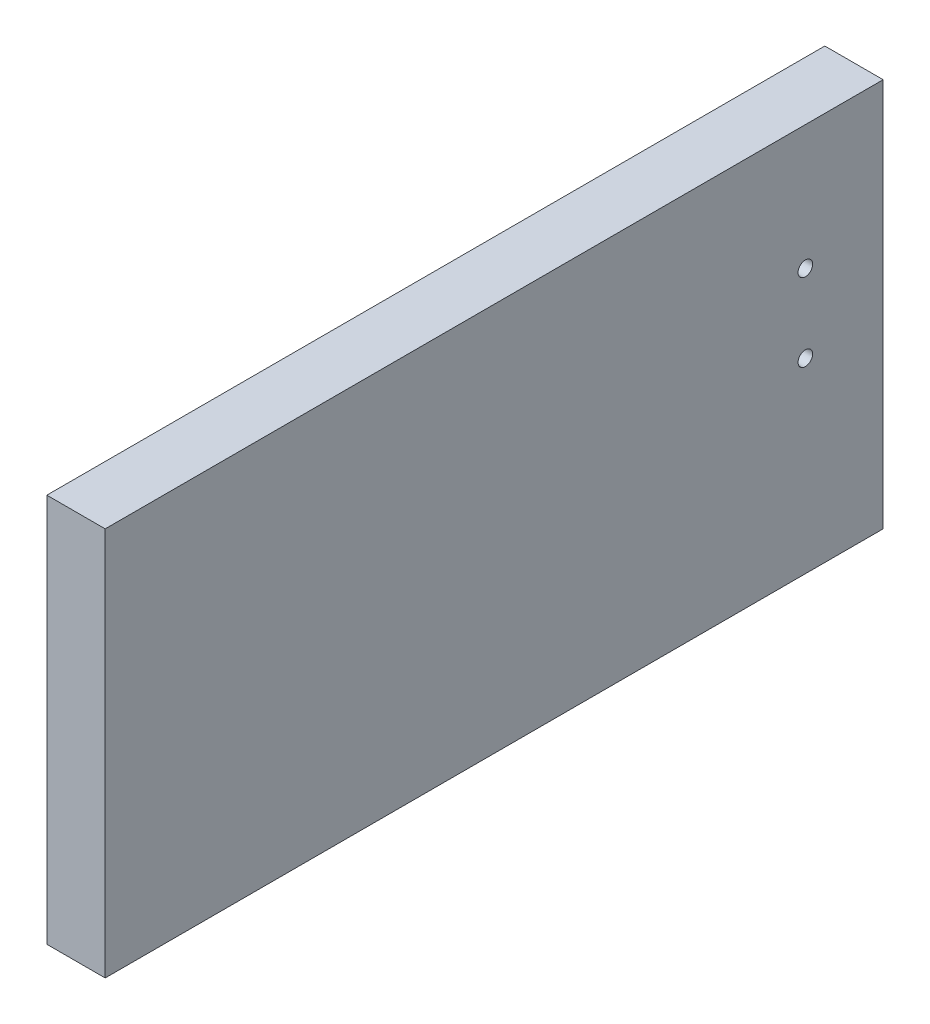
ISO-10303-21;
HEADER;
FILE_DESCRIPTION(('STEP AP214'),'2;1');
FILE_NAME('part.step','',(''),(''),'','','');
FILE_SCHEMA(('AUTOMOTIVE_DESIGN { 1 0 10303 214 1 1 1 1 }'));
ENDSEC;
DATA;
#1=APPLICATION_CONTEXT('core data for automotive mechanical design processes');
#2=APPLICATION_PROTOCOL_DEFINITION('international standard','automotive_design',2000,#1);
#3=PRODUCT_CONTEXT('',#1,'mechanical');
#4=PRODUCT('Part','Part','',(#3));
#5=PRODUCT_RELATED_PRODUCT_CATEGORY('part','',(#4));
#6=PRODUCT_DEFINITION_FORMATION('','',#4);
#7=PRODUCT_DEFINITION_CONTEXT('part definition',#1,'design');
#8=PRODUCT_DEFINITION('design','',#6,#7);
#9=PRODUCT_DEFINITION_SHAPE('','',#8);
#10=(LENGTH_UNIT() NAMED_UNIT(*) SI_UNIT(.MILLI.,.METRE.));
#11=(NAMED_UNIT(*) PLANE_ANGLE_UNIT() SI_UNIT($,.RADIAN.));
#12=(NAMED_UNIT(*) SI_UNIT($,.STERADIAN.) SOLID_ANGLE_UNIT());
#13=UNCERTAINTY_MEASURE_WITH_UNIT(LENGTH_MEASURE(1.E-05),#10,'distance_accuracy_value','');
#14=(GEOMETRIC_REPRESENTATION_CONTEXT(3) GLOBAL_UNCERTAINTY_ASSIGNED_CONTEXT((#13)) GLOBAL_UNIT_ASSIGNED_CONTEXT((#10,
#11,#12)) REPRESENTATION_CONTEXT('',''));
#15=CARTESIAN_POINT('',(0.,0.,0.));
#16=DIRECTION('',(0.,0.,1.));
#17=DIRECTION('',(1.,0.,0.));
#18=AXIS2_PLACEMENT_3D('',#15,#16,#17);
#19=CARTESIAN_POINT('',(9.52499999999999,63.5,254.));
#20=DIRECTION('',(-1.,0.,0.));
#21=DIRECTION('',(0.,-1.,0.));
#22=AXIS2_PLACEMENT_3D('',#19,#20,#21);
#23=PLANE('',#22);
#24=CARTESIAN_POINT('',(9.52500000000002,-2.54,25.4));
#25=DIRECTION('',(-1.,0.,0.));
#26=DIRECTION('',(0.,-1.,0.));
#27=AXIS2_PLACEMENT_3D('',#24,#25,#26);
#28=CIRCLE('',#27,2.38125);
#29=CARTESIAN_POINT('',(9.52500000000002,-4.92125,25.4));
#30=VERTEX_POINT('',#29);
#31=EDGE_CURVE('E114',#30,#30,#28,.T.);
#32=ORIENTED_EDGE('',*,*,#31,.T.);
#33=EDGE_LOOP('',(#32));
#34=FACE_BOUND('',#33,.T.);
#35=CARTESIAN_POINT('',(9.52500000000001,22.86,25.4000000000001));
#36=DIRECTION('',(-1.,0.,0.));
#37=DIRECTION('',(0.,-1.,0.));
#38=AXIS2_PLACEMENT_3D('',#35,#36,#37);
#39=CIRCLE('',#38,2.38125000000001);
#40=CARTESIAN_POINT('',(9.52500000000001,20.47875,25.4000000000001));
#41=VERTEX_POINT('',#40);
#42=EDGE_CURVE('E100',#41,#41,#39,.T.);
#43=ORIENTED_EDGE('',*,*,#42,.T.);
#44=EDGE_LOOP('',(#43));
#45=FACE_BOUND('',#44,.T.);
#46=DIRECTION('',(0.,1.,0.));
#47=VECTOR('',#46,1.);
#48=CARTESIAN_POINT('',(9.52499999999999,63.5,0.));
#49=LINE('',#48,#47);
#50=CARTESIAN_POINT('',(9.52500000000001,-63.5,0.));
#51=VERTEX_POINT('',#50);
#52=CARTESIAN_POINT('',(9.52499999999999,63.5,0.));
#53=VERTEX_POINT('',#52);
#54=EDGE_CURVE('E97',#51,#53,#49,.T.);
#55=ORIENTED_EDGE('',*,*,#54,.T.);
#56=DIRECTION('',(0.,0.,-1.));
#57=VECTOR('',#56,1.);
#58=CARTESIAN_POINT('',(9.52499999999999,63.5,254.));
#59=LINE('',#58,#57);
#60=CARTESIAN_POINT('',(9.52499999999999,63.5,254.));
#61=VERTEX_POINT('',#60);
#62=EDGE_CURVE('E11',#61,#53,#59,.T.);
#63=ORIENTED_EDGE('',*,*,#62,.F.);
#64=DIRECTION('',(0.,1.,0.));
#65=VECTOR('',#64,1.);
#66=CARTESIAN_POINT('',(9.52499999999999,63.5,254.));
#67=LINE('',#66,#65);
#68=CARTESIAN_POINT('',(9.52500000000001,-63.5,254.));
#69=VERTEX_POINT('',#68);
#70=EDGE_CURVE('E85',#69,#61,#67,.T.);
#71=ORIENTED_EDGE('',*,*,#70,.F.);
#72=DIRECTION('',(0.,0.,-1.));
#73=VECTOR('',#72,1.);
#74=CARTESIAN_POINT('',(9.52500000000001,-63.5,254.));
#75=LINE('',#74,#73);
#76=EDGE_CURVE('E93',#69,#51,#75,.T.);
#77=ORIENTED_EDGE('',*,*,#76,.T.);
#78=EDGE_LOOP('',(#55,#63,#71,#77));
#79=FACE_BOUND('',#78,.T.);
#80=ADVANCED_FACE('F34',(#34,#45,#79),#23,.F.);
#81=CARTESIAN_POINT('',(-9.52500000000001,63.5,254.));
#82=DIRECTION('',(0.,-1.,0.));
#83=DIRECTION('',(0.,0.,-1.));
#84=AXIS2_PLACEMENT_3D('',#81,#82,#83);
#85=PLANE('',#84);
#86=DIRECTION('',(-1.,0.,0.));
#87=VECTOR('',#86,1.);
#88=CARTESIAN_POINT('',(-9.52500000000001,63.5,0.));
#89=LINE('',#88,#87);
#90=CARTESIAN_POINT('',(-9.52500000000001,63.5,0.));
#91=VERTEX_POINT('',#90);
#92=EDGE_CURVE('E89',#53,#91,#89,.T.);
#93=ORIENTED_EDGE('',*,*,#92,.T.);
#94=DIRECTION('',(0.,0.,-1.));
#95=VECTOR('',#94,1.);
#96=CARTESIAN_POINT('',(-9.52500000000001,63.5,254.));
#97=LINE('',#96,#95);
#98=CARTESIAN_POINT('',(-9.52500000000001,63.5,254.));
#99=VERTEX_POINT('',#98);
#100=EDGE_CURVE('E42',#99,#91,#97,.T.);
#101=ORIENTED_EDGE('',*,*,#100,.F.);
#102=DIRECTION('',(-1.,0.,0.));
#103=VECTOR('',#102,1.);
#104=CARTESIAN_POINT('',(-9.52500000000001,63.5,254.));
#105=LINE('',#104,#103);
#106=EDGE_CURVE('E80',#61,#99,#105,.T.);
#107=ORIENTED_EDGE('',*,*,#106,.F.);
#108=ORIENTED_EDGE('',*,*,#62,.T.);
#109=EDGE_LOOP('',(#93,#101,#107,#108));
#110=FACE_BOUND('',#109,.T.);
#111=ADVANCED_FACE('F88',(#110),#85,.F.);
#112=CARTESIAN_POINT('',(-9.52500000000001,63.5,254.));
#113=DIRECTION('',(1.,0.,0.));
#114=DIRECTION('',(0.,1.,0.));
#115=AXIS2_PLACEMENT_3D('',#112,#113,#114);
#116=PLANE('',#115);
#117=CARTESIAN_POINT('',(-9.525,-2.54,25.4));
#118=DIRECTION('',(-1.,0.,0.));
#119=DIRECTION('',(0.,-1.,0.));
#120=AXIS2_PLACEMENT_3D('',#117,#118,#119);
#121=CIRCLE('',#120,2.38125);
#122=CARTESIAN_POINT('',(-9.525,-4.92125,25.4));
#123=VERTEX_POINT('',#122);
#124=EDGE_CURVE('E117',#123,#123,#121,.T.);
#125=ORIENTED_EDGE('',*,*,#124,.F.);
#126=EDGE_LOOP('',(#125));
#127=FACE_BOUND('',#126,.T.);
#128=CARTESIAN_POINT('',(-9.52500000000001,22.86,25.4000000000001));
#129=DIRECTION('',(-1.,0.,0.));
#130=DIRECTION('',(0.,-1.,0.));
#131=AXIS2_PLACEMENT_3D('',#128,#129,#130);
#132=CIRCLE('',#131,2.38125000000001);
#133=CARTESIAN_POINT('',(-9.52500000000001,20.47875,25.4000000000001));
#134=VERTEX_POINT('',#133);
#135=EDGE_CURVE('E111',#134,#134,#132,.T.);
#136=ORIENTED_EDGE('',*,*,#135,.F.);
#137=EDGE_LOOP('',(#136));
#138=FACE_BOUND('',#137,.T.);
#139=DIRECTION('',(0.,-1.,0.));
#140=VECTOR('',#139,1.);
#141=CARTESIAN_POINT('',(-9.52500000000001,63.5,0.));
#142=LINE('',#141,#140);
#143=CARTESIAN_POINT('',(-9.525,-63.5,0.));
#144=VERTEX_POINT('',#143);
#145=EDGE_CURVE('E67',#91,#144,#142,.T.);
#146=ORIENTED_EDGE('',*,*,#145,.T.);
#147=DIRECTION('',(0.,0.,-1.));
#148=VECTOR('',#147,1.);
#149=CARTESIAN_POINT('',(-9.525,-63.5,254.));
#150=LINE('',#149,#148);
#151=CARTESIAN_POINT('',(-9.525,-63.5,254.));
#152=VERTEX_POINT('',#151);
#153=EDGE_CURVE('E90',#152,#144,#150,.T.);
#154=ORIENTED_EDGE('',*,*,#153,.F.);
#155=DIRECTION('',(0.,-1.,0.));
#156=VECTOR('',#155,1.);
#157=CARTESIAN_POINT('',(-9.52500000000001,63.5,254.));
#158=LINE('',#157,#156);
#159=EDGE_CURVE('E83',#99,#152,#158,.T.);
#160=ORIENTED_EDGE('',*,*,#159,.F.);
#161=ORIENTED_EDGE('',*,*,#100,.T.);
#162=EDGE_LOOP('',(#146,#154,#160,#161));
#163=FACE_BOUND('',#162,.T.);
#164=ADVANCED_FACE('F91',(#127,#138,#163),#116,.F.);
#165=CARTESIAN_POINT('',(-9.525,-63.5,254.));
#166=DIRECTION('',(0.,1.,0.));
#167=DIRECTION('',(0.,0.,1.));
#168=AXIS2_PLACEMENT_3D('',#165,#166,#167);
#169=PLANE('',#168);
#170=DIRECTION('',(1.,0.,0.));
#171=VECTOR('',#170,1.);
#172=CARTESIAN_POINT('',(-9.525,-63.5,0.));
#173=LINE('',#172,#171);
#174=EDGE_CURVE('E73',#144,#51,#173,.T.);
#175=ORIENTED_EDGE('',*,*,#174,.T.);
#176=ORIENTED_EDGE('',*,*,#76,.F.);
#177=DIRECTION('',(1.,0.,0.));
#178=VECTOR('',#177,1.);
#179=CARTESIAN_POINT('',(-9.525,-63.5,254.));
#180=LINE('',#179,#178);
#181=EDGE_CURVE('E50',#152,#69,#180,.T.);
#182=ORIENTED_EDGE('',*,*,#181,.F.);
#183=ORIENTED_EDGE('',*,*,#153,.T.);
#184=EDGE_LOOP('',(#175,#176,#182,#183));
#185=FACE_BOUND('',#184,.T.);
#186=ADVANCED_FACE('F105',(#185),#169,.F.);
#187=CARTESIAN_POINT('',(0.,0.,254.));
#188=DIRECTION('',(0.,0.,1.));
#189=DIRECTION('',(1.,0.,0.));
#190=AXIS2_PLACEMENT_3D('',#187,#188,#189);
#191=PLANE('',#190);
#192=ORIENTED_EDGE('',*,*,#70,.T.);
#193=ORIENTED_EDGE('',*,*,#106,.T.);
#194=ORIENTED_EDGE('',*,*,#159,.T.);
#195=ORIENTED_EDGE('',*,*,#181,.T.);
#196=EDGE_LOOP('',(#192,#193,#194,#195));
#197=FACE_BOUND('',#196,.T.);
#198=ADVANCED_FACE('F81',(#197),#191,.T.);
#199=CARTESIAN_POINT('',(0.,0.,0.));
#200=DIRECTION('',(0.,0.,1.));
#201=DIRECTION('',(1.,0.,0.));
#202=AXIS2_PLACEMENT_3D('',#199,#200,#201);
#203=PLANE('',#202);
#204=ORIENTED_EDGE('',*,*,#54,.F.);
#205=ORIENTED_EDGE('',*,*,#174,.F.);
#206=ORIENTED_EDGE('',*,*,#145,.F.);
#207=ORIENTED_EDGE('',*,*,#92,.F.);
#208=EDGE_LOOP('',(#204,#205,#206,#207));
#209=FACE_BOUND('',#208,.T.);
#210=ADVANCED_FACE('F108',(#209),#203,.F.);
#211=CARTESIAN_POINT('',(9.52500000000001,22.86,25.4000000000001));
#212=DIRECTION('',(-1.,0.,0.));
#213=DIRECTION('',(0.,-1.,0.));
#214=AXIS2_PLACEMENT_3D('',#211,#212,#213);
#215=CYLINDRICAL_SURFACE('',#214,2.38125000000001);
#216=ORIENTED_EDGE('',*,*,#42,.F.);
#217=EDGE_LOOP('',(#216));
#218=FACE_BOUND('',#217,.T.);
#219=ORIENTED_EDGE('',*,*,#135,.T.);
#220=EDGE_LOOP('',(#219));
#221=FACE_BOUND('',#220,.T.);
#222=ADVANCED_FACE('F128',(#218,#221),#215,.F.);
#223=CARTESIAN_POINT('',(9.52500000000002,-2.54,25.4));
#224=DIRECTION('',(-1.,0.,0.));
#225=DIRECTION('',(0.,-1.,0.));
#226=AXIS2_PLACEMENT_3D('',#223,#224,#225);
#227=CYLINDRICAL_SURFACE('',#226,2.38125);
#228=ORIENTED_EDGE('',*,*,#31,.F.);
#229=EDGE_LOOP('',(#228));
#230=FACE_BOUND('',#229,.T.);
#231=ORIENTED_EDGE('',*,*,#124,.T.);
#232=EDGE_LOOP('',(#231));
#233=FACE_BOUND('',#232,.T.);
#234=ADVANCED_FACE('F125',(#230,#233),#227,.F.);
#235=CLOSED_SHELL('',(#80,#111,#164,#186,#198,#210,#222,#234));
#236=MANIFOLD_SOLID_BREP('B2',#235);
#237=ADVANCED_BREP_SHAPE_REPRESENTATION('',(#18,#236),#14);
#238=SHAPE_DEFINITION_REPRESENTATION(#9,#237);
ENDSEC;
END-ISO-10303-21;
